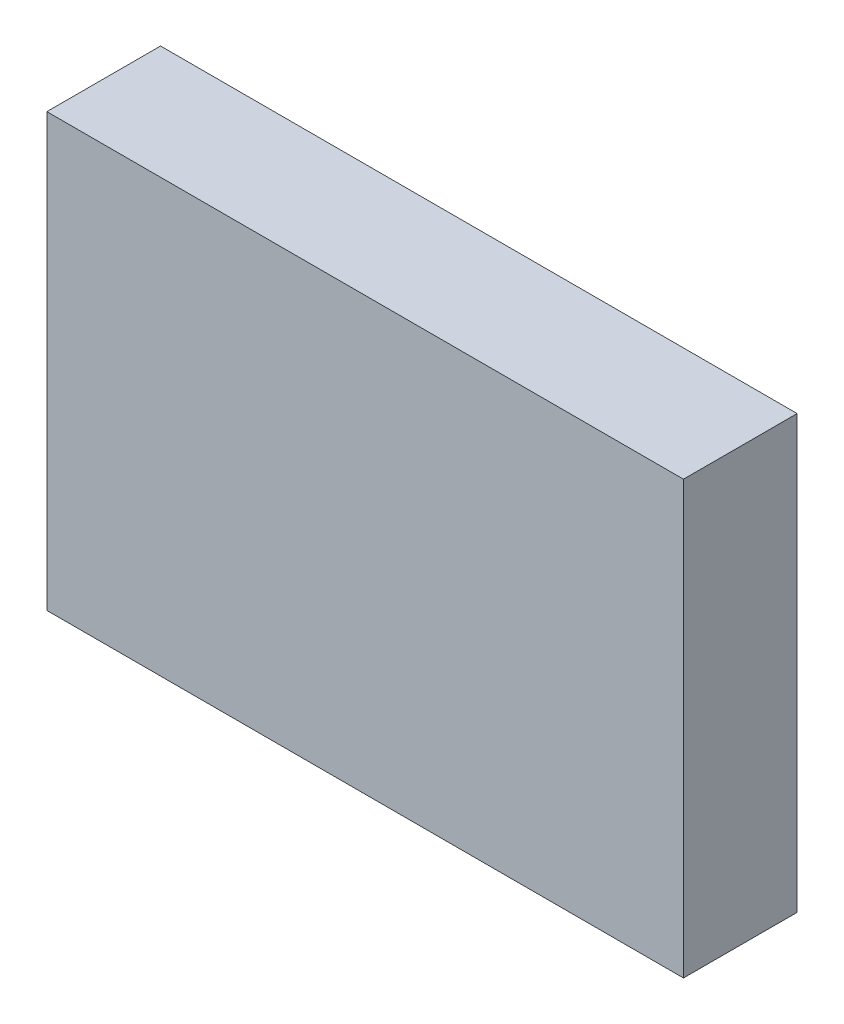
ISO-10303-21;
HEADER;
FILE_DESCRIPTION(('STEP AP214'),'2;1');
FILE_NAME('part.step','',(''),(''),'','','');
FILE_SCHEMA(('AUTOMOTIVE_DESIGN { 1 0 10303 214 1 1 1 1 }'));
ENDSEC;
DATA;
#1=APPLICATION_CONTEXT('core data for automotive mechanical design processes');
#2=APPLICATION_PROTOCOL_DEFINITION('international standard','automotive_design',2000,#1);
#3=PRODUCT_CONTEXT('',#1,'mechanical');
#4=PRODUCT('Part','Part','',(#3));
#5=PRODUCT_RELATED_PRODUCT_CATEGORY('part','',(#4));
#6=PRODUCT_DEFINITION_FORMATION('','',#4);
#7=PRODUCT_DEFINITION_CONTEXT('part definition',#1,'design');
#8=PRODUCT_DEFINITION('design','',#6,#7);
#9=PRODUCT_DEFINITION_SHAPE('','',#8);
#10=(LENGTH_UNIT() NAMED_UNIT(*) SI_UNIT(.MILLI.,.METRE.));
#11=(NAMED_UNIT(*) PLANE_ANGLE_UNIT() SI_UNIT($,.RADIAN.));
#12=(NAMED_UNIT(*) SI_UNIT($,.STERADIAN.) SOLID_ANGLE_UNIT());
#13=UNCERTAINTY_MEASURE_WITH_UNIT(LENGTH_MEASURE(1.E-05),#10,'distance_accuracy_value','');
#14=(GEOMETRIC_REPRESENTATION_CONTEXT(3) GLOBAL_UNCERTAINTY_ASSIGNED_CONTEXT((#13)) GLOBAL_UNIT_ASSIGNED_CONTEXT((#10,
#11,#12)) REPRESENTATION_CONTEXT('',''));
#15=CARTESIAN_POINT('',(0.,0.,0.));
#16=DIRECTION('',(0.,0.,1.));
#17=DIRECTION('',(1.,0.,0.));
#18=AXIS2_PLACEMENT_3D('',#15,#16,#17);
#19=CARTESIAN_POINT('',(70.,-47.5,25.));
#20=DIRECTION('',(-1.,0.,0.));
#21=DIRECTION('',(0.,0.,1.));
#22=AXIS2_PLACEMENT_3D('',#19,#20,#21);
#23=PLANE('',#22);
#24=DIRECTION('',(0.,1.,0.));
#25=VECTOR('',#24,1.);
#26=CARTESIAN_POINT('',(70.,-47.5,0.));
#27=LINE('',#26,#25);
#28=CARTESIAN_POINT('',(70.,-47.5,0.));
#29=VERTEX_POINT('',#28);
#30=CARTESIAN_POINT('',(70.,47.5,0.));
#31=VERTEX_POINT('',#30);
#32=EDGE_CURVE('E113',#29,#31,#27,.T.);
#33=ORIENTED_EDGE('',*,*,#32,.T.);
#34=DIRECTION('',(0.,0.,-1.));
#35=VECTOR('',#34,1.);
#36=CARTESIAN_POINT('',(70.,47.5,25.));
#37=LINE('',#36,#35);
#38=CARTESIAN_POINT('',(70.,47.5,25.));
#39=VERTEX_POINT('',#38);
#40=EDGE_CURVE('E11',#39,#31,#37,.T.);
#41=ORIENTED_EDGE('',*,*,#40,.F.);
#42=DIRECTION('',(0.,1.,0.));
#43=VECTOR('',#42,1.);
#44=CARTESIAN_POINT('',(70.,-47.5,25.));
#45=LINE('',#44,#43);
#46=CARTESIAN_POINT('',(70.,-47.5,25.));
#47=VERTEX_POINT('',#46);
#48=EDGE_CURVE('E97',#47,#39,#45,.T.);
#49=ORIENTED_EDGE('',*,*,#48,.F.);
#50=DIRECTION('',(0.,0.,-1.));
#51=VECTOR('',#50,1.);
#52=CARTESIAN_POINT('',(70.,-47.5,25.));
#53=LINE('',#52,#51);
#54=EDGE_CURVE('E109',#47,#29,#53,.T.);
#55=ORIENTED_EDGE('',*,*,#54,.T.);
#56=EDGE_LOOP('',(#33,#41,#49,#55));
#57=FACE_BOUND('',#56,.T.);
#58=ADVANCED_FACE('F45',(#57),#23,.F.);
#59=CARTESIAN_POINT('',(-70.,47.5,25.));
#60=DIRECTION('',(0.,-1.,0.));
#61=DIRECTION('',(0.,0.,-1.));
#62=AXIS2_PLACEMENT_3D('',#59,#60,#61);
#63=PLANE('',#62);
#64=DIRECTION('',(-1.,0.,0.));
#65=VECTOR('',#64,1.);
#66=CARTESIAN_POINT('',(-70.,47.5,0.));
#67=LINE('',#66,#65);
#68=CARTESIAN_POINT('',(-70.,47.5,0.));
#69=VERTEX_POINT('',#68);
#70=EDGE_CURVE('E102',#31,#69,#67,.T.);
#71=ORIENTED_EDGE('',*,*,#70,.T.);
#72=DIRECTION('',(0.,0.,-1.));
#73=VECTOR('',#72,1.);
#74=CARTESIAN_POINT('',(-70.,47.5,25.));
#75=LINE('',#74,#73);
#76=CARTESIAN_POINT('',(-70.,47.5,25.));
#77=VERTEX_POINT('',#76);
#78=EDGE_CURVE('E54',#77,#69,#75,.T.);
#79=ORIENTED_EDGE('',*,*,#78,.F.);
#80=DIRECTION('',(-1.,0.,0.));
#81=VECTOR('',#80,1.);
#82=CARTESIAN_POINT('',(-70.,47.5,25.));
#83=LINE('',#82,#81);
#84=EDGE_CURVE('E92',#39,#77,#83,.T.);
#85=ORIENTED_EDGE('',*,*,#84,.F.);
#86=ORIENTED_EDGE('',*,*,#40,.T.);
#87=EDGE_LOOP('',(#71,#79,#85,#86));
#88=FACE_BOUND('',#87,.T.);
#89=ADVANCED_FACE('F101',(#88),#63,.F.);
#90=CARTESIAN_POINT('',(-70.,-47.5,25.));
#91=DIRECTION('',(1.,0.,0.));
#92=DIRECTION('',(0.,0.,-1.));
#93=AXIS2_PLACEMENT_3D('',#90,#91,#92);
#94=PLANE('',#93);
#95=DIRECTION('',(0.,-1.,0.));
#96=VECTOR('',#95,1.);
#97=CARTESIAN_POINT('',(-70.,-47.5,0.));
#98=LINE('',#97,#96);
#99=CARTESIAN_POINT('',(-70.,-47.5,0.));
#100=VERTEX_POINT('',#99);
#101=EDGE_CURVE('E79',#69,#100,#98,.T.);
#102=ORIENTED_EDGE('',*,*,#101,.T.);
#103=DIRECTION('',(0.,0.,-1.));
#104=VECTOR('',#103,1.);
#105=CARTESIAN_POINT('',(-70.,-47.5,25.));
#106=LINE('',#105,#104);
#107=CARTESIAN_POINT('',(-70.,-47.5,25.));
#108=VERTEX_POINT('',#107);
#109=EDGE_CURVE('E104',#108,#100,#106,.T.);
#110=ORIENTED_EDGE('',*,*,#109,.F.);
#111=DIRECTION('',(0.,-1.,0.));
#112=VECTOR('',#111,1.);
#113=CARTESIAN_POINT('',(-70.,-47.5,25.));
#114=LINE('',#113,#112);
#115=EDGE_CURVE('E95',#77,#108,#114,.T.);
#116=ORIENTED_EDGE('',*,*,#115,.F.);
#117=ORIENTED_EDGE('',*,*,#78,.T.);
#118=EDGE_LOOP('',(#102,#110,#116,#117));
#119=FACE_BOUND('',#118,.T.);
#120=ADVANCED_FACE('F105',(#119),#94,.F.);
#121=CARTESIAN_POINT('',(-70.,-47.5,25.));
#122=DIRECTION('',(0.,1.,0.));
#123=DIRECTION('',(0.,0.,1.));
#124=AXIS2_PLACEMENT_3D('',#121,#122,#123);
#125=PLANE('',#124);
#126=DIRECTION('',(1.,0.,0.));
#127=VECTOR('',#126,1.);
#128=CARTESIAN_POINT('',(-70.,-47.5,0.));
#129=LINE('',#128,#127);
#130=EDGE_CURVE('E85',#100,#29,#129,.T.);
#131=ORIENTED_EDGE('',*,*,#130,.T.);
#132=ORIENTED_EDGE('',*,*,#54,.F.);
#133=DIRECTION('',(1.,0.,0.));
#134=VECTOR('',#133,1.);
#135=CARTESIAN_POINT('',(-70.,-47.5,25.));
#136=LINE('',#135,#134);
#137=EDGE_CURVE('E62',#108,#47,#136,.T.);
#138=ORIENTED_EDGE('',*,*,#137,.F.);
#139=ORIENTED_EDGE('',*,*,#109,.T.);
#140=EDGE_LOOP('',(#131,#132,#138,#139));
#141=FACE_BOUND('',#140,.T.);
#142=ADVANCED_FACE('F126',(#141),#125,.F.);
#143=CARTESIAN_POINT('',(0.,0.,25.));
#144=DIRECTION('',(0.,0.,-1.));
#145=DIRECTION('',(-1.,0.,0.));
#146=AXIS2_PLACEMENT_3D('',#143,#144,#145);
#147=PLANE('',#146);
#148=ORIENTED_EDGE('',*,*,#48,.T.);
#149=ORIENTED_EDGE('',*,*,#84,.T.);
#150=ORIENTED_EDGE('',*,*,#115,.T.);
#151=ORIENTED_EDGE('',*,*,#137,.T.);
#152=EDGE_LOOP('',(#148,#149,#150,#151));
#153=FACE_BOUND('',#152,.T.);
#154=ADVANCED_FACE('F93',(#153),#147,.F.);
#155=CARTESIAN_POINT('',(0.,0.,0.));
#156=DIRECTION('',(0.,0.,-1.));
#157=DIRECTION('',(-1.,0.,0.));
#158=AXIS2_PLACEMENT_3D('',#155,#156,#157);
#159=PLANE('',#158);
#160=ORIENTED_EDGE('',*,*,#32,.F.);
#161=ORIENTED_EDGE('',*,*,#130,.F.);
#162=ORIENTED_EDGE('',*,*,#101,.F.);
#163=ORIENTED_EDGE('',*,*,#70,.F.);
#164=EDGE_LOOP('',(#160,#161,#162,#163));
#165=FACE_BOUND('',#164,.T.);
#166=ADVANCED_FACE('F129',(#165),#159,.T.);
#167=CLOSED_SHELL('',(#58,#89,#120,#142,#154,#166));
#168=MANIFOLD_SOLID_BREP('B2',#167);
#169=ADVANCED_BREP_SHAPE_REPRESENTATION('',(#18,#168),#14);
#170=SHAPE_DEFINITION_REPRESENTATION(#9,#169);
ENDSEC;
END-ISO-10303-21;
